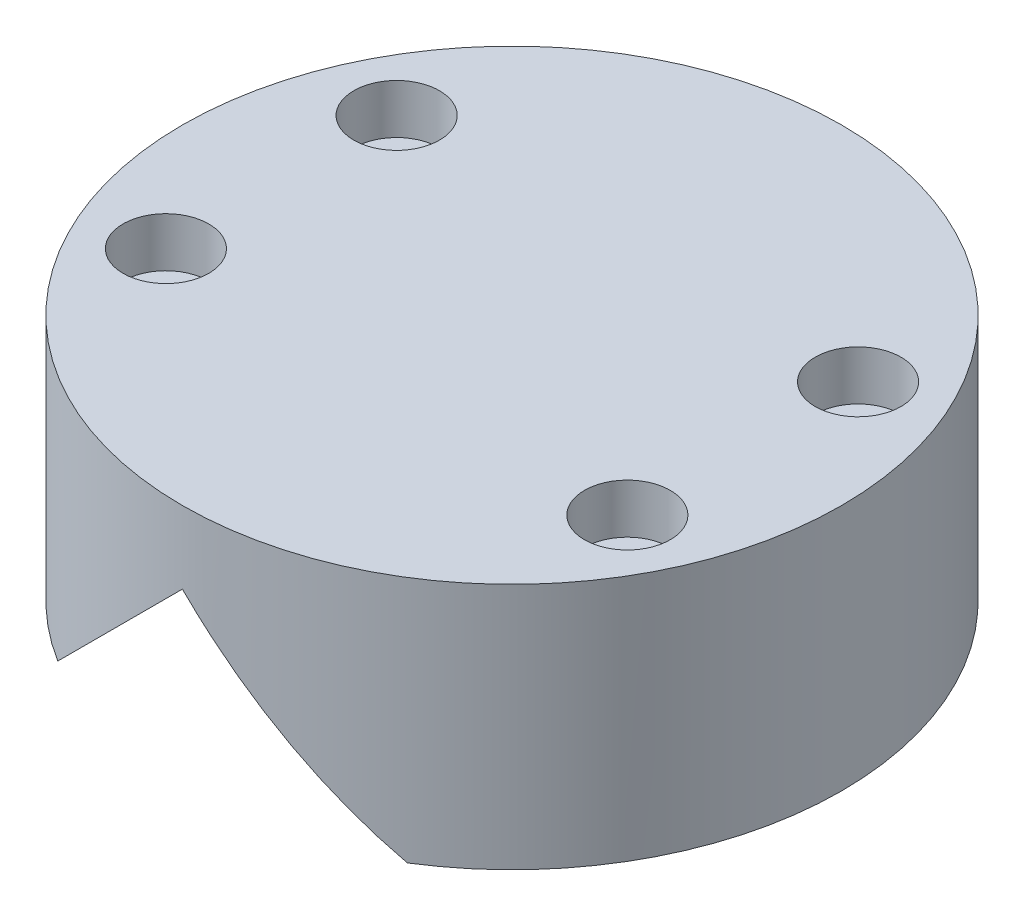
ISO-10303-21;
HEADER;
FILE_DESCRIPTION(('STEP AP214'),'2;1');
FILE_NAME('part.step','',(''),(''),'','','');
FILE_SCHEMA(('AUTOMOTIVE_DESIGN { 1 0 10303 214 1 1 1 1 }'));
ENDSEC;
DATA;
#1=APPLICATION_CONTEXT('core data for automotive mechanical design processes');
#2=APPLICATION_PROTOCOL_DEFINITION('international standard','automotive_design',2000,#1);
#3=PRODUCT_CONTEXT('',#1,'mechanical');
#4=PRODUCT('Part','Part','',(#3));
#5=PRODUCT_RELATED_PRODUCT_CATEGORY('part','',(#4));
#6=PRODUCT_DEFINITION_FORMATION('','',#4);
#7=PRODUCT_DEFINITION_CONTEXT('part definition',#1,'design');
#8=PRODUCT_DEFINITION('design','',#6,#7);
#9=PRODUCT_DEFINITION_SHAPE('','',#8);
#10=(LENGTH_UNIT() NAMED_UNIT(*) SI_UNIT(.MILLI.,.METRE.));
#11=(NAMED_UNIT(*) PLANE_ANGLE_UNIT() SI_UNIT($,.RADIAN.));
#12=(NAMED_UNIT(*) SI_UNIT($,.STERADIAN.) SOLID_ANGLE_UNIT());
#13=UNCERTAINTY_MEASURE_WITH_UNIT(LENGTH_MEASURE(1.E-05),#10,'distance_accuracy_value','');
#14=(GEOMETRIC_REPRESENTATION_CONTEXT(3) GLOBAL_UNCERTAINTY_ASSIGNED_CONTEXT((#13)) GLOBAL_UNIT_ASSIGNED_CONTEXT((#10,
#11,#12)) REPRESENTATION_CONTEXT('',''));
#15=CARTESIAN_POINT('',(0.,0.,0.));
#16=DIRECTION('',(0.,0.,1.));
#17=DIRECTION('',(1.,0.,0.));
#18=AXIS2_PLACEMENT_3D('',#15,#16,#17);
#19=CARTESIAN_POINT('',(-14.,15.001,7.));
#20=DIRECTION('',(0.,-1.,0.));
#21=DIRECTION('',(0.,0.,-1.));
#22=AXIS2_PLACEMENT_3D('',#19,#20,#21);
#23=CYLINDRICAL_SURFACE('',#22,1.5);
#24=CARTESIAN_POINT('',(-14.,0.,7.));
#25=DIRECTION('',(0.,-1.,0.));
#26=DIRECTION('',(0.,0.,-1.));
#27=AXIS2_PLACEMENT_3D('',#24,#25,#26);
#28=CIRCLE('',#27,1.5);
#29=CARTESIAN_POINT('',(-14.,0.,5.5));
#30=VERTEX_POINT('',#29);
#31=EDGE_CURVE('E116',#30,#30,#28,.T.);
#32=CARTESIAN_POINT('',(-14.,12.,7.));
#33=DIRECTION('',(0.,1.,0.));
#34=DIRECTION('',(0.,0.,1.));
#35=AXIS2_PLACEMENT_3D('',#32,#33,#34);
#36=CIRCLE('',#35,1.5);
#37=CARTESIAN_POINT('',(-14.,12.,5.5));
#38=VERTEX_POINT('',#37);
#39=EDGE_CURVE('E37',#38,#38,#36,.F.);
#40=CARTESIAN_POINT('',(-14.,0.,5.5));
#41=CARTESIAN_POINT('',(-14.,0.125,5.5));
#42=CARTESIAN_POINT('',(-14.,0.25,5.5));
#43=CARTESIAN_POINT('',(-14.,0.5,5.5));
#44=CARTESIAN_POINT('',(-14.,0.625000000000001,5.5));
#45=CARTESIAN_POINT('',(-14.,0.875000000000001,5.5));
#46=CARTESIAN_POINT('',(-14.,1.,5.5));
#47=CARTESIAN_POINT('',(-14.,1.25,5.5));
#48=CARTESIAN_POINT('',(-14.,1.375,5.5));
#49=CARTESIAN_POINT('',(-14.,1.625,5.5));
#50=CARTESIAN_POINT('',(-14.,1.75,5.5));
#51=CARTESIAN_POINT('',(-14.,2.,5.5));
#52=CARTESIAN_POINT('',(-14.,2.125,5.5));
#53=CARTESIAN_POINT('',(-14.,2.375,5.5));
#54=CARTESIAN_POINT('',(-14.,2.5,5.5));
#55=CARTESIAN_POINT('',(-14.,2.75,5.5));
#56=CARTESIAN_POINT('',(-14.,2.875,5.5));
#57=CARTESIAN_POINT('',(-14.,3.125,5.5));
#58=CARTESIAN_POINT('',(-14.,3.25,5.5));
#59=CARTESIAN_POINT('',(-14.,3.5,5.5));
#60=CARTESIAN_POINT('',(-14.,3.625,5.5));
#61=CARTESIAN_POINT('',(-14.,3.875,5.5));
#62=CARTESIAN_POINT('',(-14.,4.,5.5));
#63=CARTESIAN_POINT('',(-14.,4.25,5.5));
#64=CARTESIAN_POINT('',(-14.,4.375,5.5));
#65=CARTESIAN_POINT('',(-14.,4.625,5.5));
#66=CARTESIAN_POINT('',(-14.,4.75,5.5));
#67=CARTESIAN_POINT('',(-14.,5.,5.5));
#68=CARTESIAN_POINT('',(-14.,5.125,5.5));
#69=CARTESIAN_POINT('',(-14.,5.375,5.5));
#70=CARTESIAN_POINT('',(-14.,5.5,5.5));
#71=CARTESIAN_POINT('',(-14.,5.75,5.5));
#72=CARTESIAN_POINT('',(-14.,5.875,5.5));
#73=CARTESIAN_POINT('',(-14.,6.125,5.5));
#74=CARTESIAN_POINT('',(-14.,6.25,5.5));
#75=CARTESIAN_POINT('',(-14.,6.5,5.5));
#76=CARTESIAN_POINT('',(-14.,6.625,5.5));
#77=CARTESIAN_POINT('',(-14.,6.875,5.5));
#78=CARTESIAN_POINT('',(-14.,7.,5.5));
#79=CARTESIAN_POINT('',(-14.,7.25,5.5));
#80=CARTESIAN_POINT('',(-14.,7.375,5.5));
#81=CARTESIAN_POINT('',(-14.,7.625,5.5));
#82=CARTESIAN_POINT('',(-14.,7.75,5.5));
#83=CARTESIAN_POINT('',(-14.,8.,5.5));
#84=CARTESIAN_POINT('',(-14.,8.125,5.5));
#85=CARTESIAN_POINT('',(-14.,8.375,5.5));
#86=CARTESIAN_POINT('',(-14.,8.5,5.5));
#87=CARTESIAN_POINT('',(-14.,8.75,5.5));
#88=CARTESIAN_POINT('',(-14.,8.875,5.5));
#89=CARTESIAN_POINT('',(-14.,9.125,5.5));
#90=CARTESIAN_POINT('',(-14.,9.25,5.5));
#91=CARTESIAN_POINT('',(-14.,9.5,5.5));
#92=CARTESIAN_POINT('',(-14.,9.625,5.5));
#93=CARTESIAN_POINT('',(-14.,9.875,5.5));
#94=CARTESIAN_POINT('',(-14.,10.,5.5));
#95=CARTESIAN_POINT('',(-14.,10.25,5.5));
#96=CARTESIAN_POINT('',(-14.,10.375,5.5));
#97=CARTESIAN_POINT('',(-14.,10.625,5.5));
#98=CARTESIAN_POINT('',(-14.,10.75,5.5));
#99=CARTESIAN_POINT('',(-14.,11.,5.5));
#100=CARTESIAN_POINT('',(-14.,11.125,5.5));
#101=CARTESIAN_POINT('',(-14.,11.375,5.5));
#102=CARTESIAN_POINT('',(-14.,11.5,5.5));
#103=CARTESIAN_POINT('',(-14.,11.75,5.5));
#104=CARTESIAN_POINT('',(-14.,11.875,5.5));
#105=CARTESIAN_POINT('',(-14.,12.,5.5));
#106=B_SPLINE_CURVE_WITH_KNOTS('',3,(#40,#41,#42,#43,#44,#45,#46,#47,#48,#49,#50,#51,#52,#53,
#54,#55,#56,#57,#58,#59,#60,#61,#62,#63,#64,#65,#66,#67,#68,#69,#70,#71,#72,#73,#74,#75,#76,#77,
#78,#79,#80,#81,#82,#83,#84,#85,#86,#87,#88,#89,#90,#91,#92,#93,#94,#95,#96,#97,#98,#99,#100,
#101,#102,#103,#104,#105),.UNSPECIFIED.,.F.,.F.,(4,2,2,2,2,2,2,2,2,2,2,2,2,2,2,2,2,2,2,2,2,2,2,
2,2,2,2,2,2,2,2,2,4),(0.,0.375,0.750000000000001,1.125,1.5,1.875,2.25,2.625,3.,3.375,3.75,4.125,
4.5,4.875,5.25,5.625,6.,6.375,6.75,7.125,7.5,7.875,8.25,8.625,9.,9.375,9.75,10.125,10.5,10.875,
11.25,11.625,12.),.UNSPECIFIED.);
#107=EDGE_CURVE('BSEAM33',#30,#38,#106,.T.);
#108=ORIENTED_EDGE('',*,*,#31,.T.);
#109=ORIENTED_EDGE('',*,*,#39,.F.);
#110=ORIENTED_EDGE('',*,*,#107,.T.);
#111=ORIENTED_EDGE('',*,*,#107,.F.);
#112=EDGE_LOOP('',(#108,#110,#109,#111));
#113=FACE_BOUND('',#112,.T.);
#114=ADVANCED_FACE('F33',(#113),#23,.F.);
#115=CARTESIAN_POINT('',(14.,15.001,-7.));
#116=DIRECTION('',(0.,-1.,0.));
#117=DIRECTION('',(0.,0.,-1.));
#118=AXIS2_PLACEMENT_3D('',#115,#116,#117);
#119=CYLINDRICAL_SURFACE('',#118,1.5);
#120=CARTESIAN_POINT('',(14.,0.,-7.));
#121=DIRECTION('',(0.,-1.,0.));
#122=DIRECTION('',(0.,0.,-1.));
#123=AXIS2_PLACEMENT_3D('',#120,#121,#122);
#124=CIRCLE('',#123,1.5);
#125=CARTESIAN_POINT('',(14.,0.,-8.5));
#126=VERTEX_POINT('',#125);
#127=EDGE_CURVE('E100',#126,#126,#124,.T.);
#128=CARTESIAN_POINT('',(14.,12.,-7.));
#129=DIRECTION('',(0.,1.,0.));
#130=DIRECTION('',(0.,0.,1.));
#131=AXIS2_PLACEMENT_3D('',#128,#129,#130);
#132=CIRCLE('',#131,1.5);
#133=CARTESIAN_POINT('',(14.,12.,-8.5));
#134=VERTEX_POINT('',#133);
#135=EDGE_CURVE('E95',#134,#134,#132,.F.);
#136=CARTESIAN_POINT('',(14.,0.,-8.5));
#137=CARTESIAN_POINT('',(14.,0.125,-8.5));
#138=CARTESIAN_POINT('',(14.,0.25,-8.5));
#139=CARTESIAN_POINT('',(14.,0.5,-8.5));
#140=CARTESIAN_POINT('',(14.,0.625000000000001,-8.5));
#141=CARTESIAN_POINT('',(14.,0.875000000000001,-8.5));
#142=CARTESIAN_POINT('',(14.,1.,-8.5));
#143=CARTESIAN_POINT('',(14.,1.25,-8.5));
#144=CARTESIAN_POINT('',(14.,1.375,-8.5));
#145=CARTESIAN_POINT('',(14.,1.625,-8.5));
#146=CARTESIAN_POINT('',(14.,1.75,-8.5));
#147=CARTESIAN_POINT('',(14.,2.,-8.5));
#148=CARTESIAN_POINT('',(14.,2.125,-8.5));
#149=CARTESIAN_POINT('',(14.,2.375,-8.5));
#150=CARTESIAN_POINT('',(14.,2.5,-8.5));
#151=CARTESIAN_POINT('',(14.,2.75,-8.5));
#152=CARTESIAN_POINT('',(14.,2.875,-8.5));
#153=CARTESIAN_POINT('',(14.,3.125,-8.5));
#154=CARTESIAN_POINT('',(14.,3.25,-8.5));
#155=CARTESIAN_POINT('',(14.,3.5,-8.5));
#156=CARTESIAN_POINT('',(14.,3.625,-8.5));
#157=CARTESIAN_POINT('',(14.,3.875,-8.5));
#158=CARTESIAN_POINT('',(14.,4.,-8.5));
#159=CARTESIAN_POINT('',(14.,4.25,-8.5));
#160=CARTESIAN_POINT('',(14.,4.375,-8.5));
#161=CARTESIAN_POINT('',(14.,4.625,-8.5));
#162=CARTESIAN_POINT('',(14.,4.75,-8.5));
#163=CARTESIAN_POINT('',(14.,5.,-8.5));
#164=CARTESIAN_POINT('',(14.,5.125,-8.5));
#165=CARTESIAN_POINT('',(14.,5.375,-8.5));
#166=CARTESIAN_POINT('',(14.,5.5,-8.5));
#167=CARTESIAN_POINT('',(14.,5.75,-8.5));
#168=CARTESIAN_POINT('',(14.,5.875,-8.5));
#169=CARTESIAN_POINT('',(14.,6.125,-8.5));
#170=CARTESIAN_POINT('',(14.,6.25,-8.5));
#171=CARTESIAN_POINT('',(14.,6.5,-8.5));
#172=CARTESIAN_POINT('',(14.,6.625,-8.5));
#173=CARTESIAN_POINT('',(14.,6.875,-8.5));
#174=CARTESIAN_POINT('',(14.,7.,-8.5));
#175=CARTESIAN_POINT('',(14.,7.25,-8.5));
#176=CARTESIAN_POINT('',(14.,7.375,-8.5));
#177=CARTESIAN_POINT('',(14.,7.625,-8.5));
#178=CARTESIAN_POINT('',(14.,7.75,-8.5));
#179=CARTESIAN_POINT('',(14.,8.,-8.5));
#180=CARTESIAN_POINT('',(14.,8.125,-8.5));
#181=CARTESIAN_POINT('',(14.,8.375,-8.5));
#182=CARTESIAN_POINT('',(14.,8.5,-8.5));
#183=CARTESIAN_POINT('',(14.,8.75,-8.5));
#184=CARTESIAN_POINT('',(14.,8.875,-8.5));
#185=CARTESIAN_POINT('',(14.,9.125,-8.5));
#186=CARTESIAN_POINT('',(14.,9.25,-8.5));
#187=CARTESIAN_POINT('',(14.,9.5,-8.5));
#188=CARTESIAN_POINT('',(14.,9.625,-8.5));
#189=CARTESIAN_POINT('',(14.,9.875,-8.5));
#190=CARTESIAN_POINT('',(14.,10.,-8.5));
#191=CARTESIAN_POINT('',(14.,10.25,-8.5));
#192=CARTESIAN_POINT('',(14.,10.375,-8.5));
#193=CARTESIAN_POINT('',(14.,10.625,-8.5));
#194=CARTESIAN_POINT('',(14.,10.75,-8.5));
#195=CARTESIAN_POINT('',(14.,11.,-8.5));
#196=CARTESIAN_POINT('',(14.,11.125,-8.5));
#197=CARTESIAN_POINT('',(14.,11.375,-8.5));
#198=CARTESIAN_POINT('',(14.,11.5,-8.5));
#199=CARTESIAN_POINT('',(14.,11.75,-8.5));
#200=CARTESIAN_POINT('',(14.,11.875,-8.5));
#201=CARTESIAN_POINT('',(14.,12.,-8.5));
#202=B_SPLINE_CURVE_WITH_KNOTS('',3,(#136,#137,#138,#139,#140,#141,#142,#143,#144,#145,#146,
#147,#148,#149,#150,#151,#152,#153,#154,#155,#156,#157,#158,#159,#160,#161,#162,#163,#164,#165,
#166,#167,#168,#169,#170,#171,#172,#173,#174,#175,#176,#177,#178,#179,#180,#181,#182,#183,#184,
#185,#186,#187,#188,#189,#190,#191,#192,#193,#194,#195,#196,#197,#198,#199,#200,#201),
.UNSPECIFIED.,.F.,.F.,(4,2,2,2,2,2,2,2,2,2,2,2,2,2,2,2,2,2,2,2,2,2,2,2,2,2,2,2,2,2,2,2,4),(0.,
0.375,0.750000000000001,1.125,1.5,1.875,2.25,2.625,3.,3.375,3.75,4.125,4.5,4.875,5.25,5.625,6.,
6.375,6.75,7.125,7.5,7.875,8.25,8.625,9.,9.375,9.75,10.125,10.5,10.875,11.25,11.625,12.),.UNSPECIFIED.);
#203=EDGE_CURVE('BSEAM139',#126,#134,#202,.T.);
#204=ORIENTED_EDGE('',*,*,#127,.T.);
#205=ORIENTED_EDGE('',*,*,#135,.F.);
#206=ORIENTED_EDGE('',*,*,#203,.T.);
#207=ORIENTED_EDGE('',*,*,#203,.F.);
#208=EDGE_LOOP('',(#204,#206,#205,#207));
#209=FACE_BOUND('',#208,.T.);
#210=ADVANCED_FACE('F139',(#209),#119,.F.);
#211=CARTESIAN_POINT('',(14.,15.001,7.));
#212=DIRECTION('',(0.,-1.,0.));
#213=DIRECTION('',(0.,0.,-1.));
#214=AXIS2_PLACEMENT_3D('',#211,#212,#213);
#215=CYLINDRICAL_SURFACE('',#214,1.5);
#216=CARTESIAN_POINT('',(14.,0.,7.));
#217=DIRECTION('',(0.,-1.,0.));
#218=DIRECTION('',(0.,0.,-1.));
#219=AXIS2_PLACEMENT_3D('',#216,#217,#218);
#220=CIRCLE('',#219,1.5);
#221=CARTESIAN_POINT('',(14.,0.,5.5));
#222=VERTEX_POINT('',#221);
#223=EDGE_CURVE('E104',#222,#222,#220,.T.);
#224=CARTESIAN_POINT('',(14.,12.,7.));
#225=DIRECTION('',(0.,1.,0.));
#226=DIRECTION('',(0.,0.,1.));
#227=AXIS2_PLACEMENT_3D('',#224,#225,#226);
#228=CIRCLE('',#227,1.5);
#229=CARTESIAN_POINT('',(14.,12.,5.5));
#230=VERTEX_POINT('',#229);
#231=EDGE_CURVE('E92',#230,#230,#228,.F.);
#232=CARTESIAN_POINT('',(14.,0.,5.5));
#233=CARTESIAN_POINT('',(14.,0.125,5.5));
#234=CARTESIAN_POINT('',(14.,0.25,5.5));
#235=CARTESIAN_POINT('',(14.,0.5,5.5));
#236=CARTESIAN_POINT('',(14.,0.625000000000001,5.5));
#237=CARTESIAN_POINT('',(14.,0.875000000000001,5.5));
#238=CARTESIAN_POINT('',(14.,1.,5.5));
#239=CARTESIAN_POINT('',(14.,1.25,5.5));
#240=CARTESIAN_POINT('',(14.,1.375,5.5));
#241=CARTESIAN_POINT('',(14.,1.625,5.5));
#242=CARTESIAN_POINT('',(14.,1.75,5.5));
#243=CARTESIAN_POINT('',(14.,2.,5.5));
#244=CARTESIAN_POINT('',(14.,2.125,5.5));
#245=CARTESIAN_POINT('',(14.,2.375,5.5));
#246=CARTESIAN_POINT('',(14.,2.5,5.5));
#247=CARTESIAN_POINT('',(14.,2.75,5.5));
#248=CARTESIAN_POINT('',(14.,2.875,5.5));
#249=CARTESIAN_POINT('',(14.,3.125,5.5));
#250=CARTESIAN_POINT('',(14.,3.25,5.5));
#251=CARTESIAN_POINT('',(14.,3.5,5.5));
#252=CARTESIAN_POINT('',(14.,3.625,5.5));
#253=CARTESIAN_POINT('',(14.,3.875,5.5));
#254=CARTESIAN_POINT('',(14.,4.,5.5));
#255=CARTESIAN_POINT('',(14.,4.25,5.5));
#256=CARTESIAN_POINT('',(14.,4.375,5.5));
#257=CARTESIAN_POINT('',(14.,4.625,5.5));
#258=CARTESIAN_POINT('',(14.,4.75,5.5));
#259=CARTESIAN_POINT('',(14.,5.,5.5));
#260=CARTESIAN_POINT('',(14.,5.125,5.5));
#261=CARTESIAN_POINT('',(14.,5.375,5.5));
#262=CARTESIAN_POINT('',(14.,5.5,5.5));
#263=CARTESIAN_POINT('',(14.,5.75,5.5));
#264=CARTESIAN_POINT('',(14.,5.875,5.5));
#265=CARTESIAN_POINT('',(14.,6.125,5.5));
#266=CARTESIAN_POINT('',(14.,6.25,5.5));
#267=CARTESIAN_POINT('',(14.,6.5,5.5));
#268=CARTESIAN_POINT('',(14.,6.625,5.5));
#269=CARTESIAN_POINT('',(14.,6.875,5.5));
#270=CARTESIAN_POINT('',(14.,7.,5.5));
#271=CARTESIAN_POINT('',(14.,7.25,5.5));
#272=CARTESIAN_POINT('',(14.,7.375,5.5));
#273=CARTESIAN_POINT('',(14.,7.625,5.5));
#274=CARTESIAN_POINT('',(14.,7.75,5.5));
#275=CARTESIAN_POINT('',(14.,8.,5.5));
#276=CARTESIAN_POINT('',(14.,8.125,5.5));
#277=CARTESIAN_POINT('',(14.,8.375,5.5));
#278=CARTESIAN_POINT('',(14.,8.5,5.5));
#279=CARTESIAN_POINT('',(14.,8.75,5.5));
#280=CARTESIAN_POINT('',(14.,8.875,5.5));
#281=CARTESIAN_POINT('',(14.,9.125,5.5));
#282=CARTESIAN_POINT('',(14.,9.25,5.5));
#283=CARTESIAN_POINT('',(14.,9.5,5.5));
#284=CARTESIAN_POINT('',(14.,9.625,5.5));
#285=CARTESIAN_POINT('',(14.,9.875,5.5));
#286=CARTESIAN_POINT('',(14.,10.,5.5));
#287=CARTESIAN_POINT('',(14.,10.25,5.5));
#288=CARTESIAN_POINT('',(14.,10.375,5.5));
#289=CARTESIAN_POINT('',(14.,10.625,5.5));
#290=CARTESIAN_POINT('',(14.,10.75,5.5));
#291=CARTESIAN_POINT('',(14.,11.,5.5));
#292=CARTESIAN_POINT('',(14.,11.125,5.5));
#293=CARTESIAN_POINT('',(14.,11.375,5.5));
#294=CARTESIAN_POINT('',(14.,11.5,5.5));
#295=CARTESIAN_POINT('',(14.,11.75,5.5));
#296=CARTESIAN_POINT('',(14.,11.875,5.5));
#297=CARTESIAN_POINT('',(14.,12.,5.5));
#298=B_SPLINE_CURVE_WITH_KNOTS('',3,(#232,#233,#234,#235,#236,#237,#238,#239,#240,#241,#242,
#243,#244,#245,#246,#247,#248,#249,#250,#251,#252,#253,#254,#255,#256,#257,#258,#259,#260,#261,
#262,#263,#264,#265,#266,#267,#268,#269,#270,#271,#272,#273,#274,#275,#276,#277,#278,#279,#280,
#281,#282,#283,#284,#285,#286,#287,#288,#289,#290,#291,#292,#293,#294,#295,#296,#297),
.UNSPECIFIED.,.F.,.F.,(4,2,2,2,2,2,2,2,2,2,2,2,2,2,2,2,2,2,2,2,2,2,2,2,2,2,2,2,2,2,2,2,4),(0.,
0.375,0.750000000000001,1.125,1.5,1.875,2.25,2.625,3.,3.375,3.75,4.125,4.5,4.875,5.25,5.625,6.,
6.375,6.75,7.125,7.5,7.875,8.25,8.625,9.,9.375,9.75,10.125,10.5,10.875,11.25,11.625,12.),.UNSPECIFIED.);
#299=EDGE_CURVE('BSEAM145',#222,#230,#298,.T.);
#300=ORIENTED_EDGE('',*,*,#223,.T.);
#301=ORIENTED_EDGE('',*,*,#231,.F.);
#302=ORIENTED_EDGE('',*,*,#299,.T.);
#303=ORIENTED_EDGE('',*,*,#299,.F.);
#304=EDGE_LOOP('',(#300,#302,#301,#303));
#305=FACE_BOUND('',#304,.T.);
#306=ADVANCED_FACE('F145',(#305),#215,.F.);
#307=CARTESIAN_POINT('',(-14.,15.001,-7.));
#308=DIRECTION('',(0.,-1.,0.));
#309=DIRECTION('',(0.,0.,-1.));
#310=AXIS2_PLACEMENT_3D('',#307,#308,#309);
#311=CYLINDRICAL_SURFACE('',#310,1.5);
#312=CARTESIAN_POINT('',(-14.,0.,-7.));
#313=DIRECTION('',(0.,-1.,0.));
#314=DIRECTION('',(0.,0.,-1.));
#315=AXIS2_PLACEMENT_3D('',#312,#313,#314);
#316=CIRCLE('',#315,1.5);
#317=CARTESIAN_POINT('',(-14.,0.,-8.5));
#318=VERTEX_POINT('',#317);
#319=EDGE_CURVE('E109',#318,#318,#316,.T.);
#320=CARTESIAN_POINT('',(-14.,12.,-7.));
#321=DIRECTION('',(0.,1.,0.));
#322=DIRECTION('',(0.,0.,1.));
#323=AXIS2_PLACEMENT_3D('',#320,#321,#322);
#324=CIRCLE('',#323,1.5);
#325=CARTESIAN_POINT('',(-14.,12.,-8.5));
#326=VERTEX_POINT('',#325);
#327=EDGE_CURVE('E89',#326,#326,#324,.F.);
#328=CARTESIAN_POINT('',(-14.,0.,-8.5));
#329=CARTESIAN_POINT('',(-14.,0.125,-8.5));
#330=CARTESIAN_POINT('',(-14.,0.25,-8.5));
#331=CARTESIAN_POINT('',(-14.,0.5,-8.5));
#332=CARTESIAN_POINT('',(-14.,0.625000000000001,-8.5));
#333=CARTESIAN_POINT('',(-14.,0.875000000000001,-8.5));
#334=CARTESIAN_POINT('',(-14.,1.,-8.5));
#335=CARTESIAN_POINT('',(-14.,1.25,-8.5));
#336=CARTESIAN_POINT('',(-14.,1.375,-8.5));
#337=CARTESIAN_POINT('',(-14.,1.625,-8.5));
#338=CARTESIAN_POINT('',(-14.,1.75,-8.5));
#339=CARTESIAN_POINT('',(-14.,2.,-8.5));
#340=CARTESIAN_POINT('',(-14.,2.125,-8.5));
#341=CARTESIAN_POINT('',(-14.,2.375,-8.5));
#342=CARTESIAN_POINT('',(-14.,2.5,-8.5));
#343=CARTESIAN_POINT('',(-14.,2.75,-8.5));
#344=CARTESIAN_POINT('',(-14.,2.875,-8.5));
#345=CARTESIAN_POINT('',(-14.,3.125,-8.5));
#346=CARTESIAN_POINT('',(-14.,3.25,-8.5));
#347=CARTESIAN_POINT('',(-14.,3.5,-8.5));
#348=CARTESIAN_POINT('',(-14.,3.625,-8.5));
#349=CARTESIAN_POINT('',(-14.,3.875,-8.5));
#350=CARTESIAN_POINT('',(-14.,4.,-8.5));
#351=CARTESIAN_POINT('',(-14.,4.25,-8.5));
#352=CARTESIAN_POINT('',(-14.,4.375,-8.5));
#353=CARTESIAN_POINT('',(-14.,4.625,-8.5));
#354=CARTESIAN_POINT('',(-14.,4.75,-8.5));
#355=CARTESIAN_POINT('',(-14.,5.,-8.5));
#356=CARTESIAN_POINT('',(-14.,5.125,-8.5));
#357=CARTESIAN_POINT('',(-14.,5.375,-8.5));
#358=CARTESIAN_POINT('',(-14.,5.5,-8.5));
#359=CARTESIAN_POINT('',(-14.,5.75,-8.5));
#360=CARTESIAN_POINT('',(-14.,5.875,-8.5));
#361=CARTESIAN_POINT('',(-14.,6.125,-8.5));
#362=CARTESIAN_POINT('',(-14.,6.25,-8.5));
#363=CARTESIAN_POINT('',(-14.,6.5,-8.5));
#364=CARTESIAN_POINT('',(-14.,6.625,-8.5));
#365=CARTESIAN_POINT('',(-14.,6.875,-8.5));
#366=CARTESIAN_POINT('',(-14.,7.,-8.5));
#367=CARTESIAN_POINT('',(-14.,7.25,-8.5));
#368=CARTESIAN_POINT('',(-14.,7.375,-8.5));
#369=CARTESIAN_POINT('',(-14.,7.625,-8.5));
#370=CARTESIAN_POINT('',(-14.,7.75,-8.5));
#371=CARTESIAN_POINT('',(-14.,8.,-8.5));
#372=CARTESIAN_POINT('',(-14.,8.125,-8.5));
#373=CARTESIAN_POINT('',(-14.,8.375,-8.5));
#374=CARTESIAN_POINT('',(-14.,8.5,-8.5));
#375=CARTESIAN_POINT('',(-14.,8.75,-8.5));
#376=CARTESIAN_POINT('',(-14.,8.875,-8.5));
#377=CARTESIAN_POINT('',(-14.,9.125,-8.5));
#378=CARTESIAN_POINT('',(-14.,9.25,-8.5));
#379=CARTESIAN_POINT('',(-14.,9.5,-8.5));
#380=CARTESIAN_POINT('',(-14.,9.625,-8.5));
#381=CARTESIAN_POINT('',(-14.,9.875,-8.5));
#382=CARTESIAN_POINT('',(-14.,10.,-8.5));
#383=CARTESIAN_POINT('',(-14.,10.25,-8.5));
#384=CARTESIAN_POINT('',(-14.,10.375,-8.5));
#385=CARTESIAN_POINT('',(-14.,10.625,-8.5));
#386=CARTESIAN_POINT('',(-14.,10.75,-8.5));
#387=CARTESIAN_POINT('',(-14.,11.,-8.5));
#388=CARTESIAN_POINT('',(-14.,11.125,-8.5));
#389=CARTESIAN_POINT('',(-14.,11.375,-8.5));
#390=CARTESIAN_POINT('',(-14.,11.5,-8.5));
#391=CARTESIAN_POINT('',(-14.,11.75,-8.5));
#392=CARTESIAN_POINT('',(-14.,11.875,-8.5));
#393=CARTESIAN_POINT('',(-14.,12.,-8.5));
#394=B_SPLINE_CURVE_WITH_KNOTS('',3,(#328,#329,#330,#331,#332,#333,#334,#335,#336,#337,#338,
#339,#340,#341,#342,#343,#344,#345,#346,#347,#348,#349,#350,#351,#352,#353,#354,#355,#356,#357,
#358,#359,#360,#361,#362,#363,#364,#365,#366,#367,#368,#369,#370,#371,#372,#373,#374,#375,#376,
#377,#378,#379,#380,#381,#382,#383,#384,#385,#386,#387,#388,#389,#390,#391,#392,#393),
.UNSPECIFIED.,.F.,.F.,(4,2,2,2,2,2,2,2,2,2,2,2,2,2,2,2,2,2,2,2,2,2,2,2,2,2,2,2,2,2,2,2,4),(0.,
0.375,0.750000000000001,1.125,1.5,1.875,2.25,2.625,3.,3.375,3.75,4.125,4.5,4.875,5.25,5.625,6.,
6.375,6.75,7.125,7.5,7.875,8.25,8.625,9.,9.375,9.75,10.125,10.5,10.875,11.25,11.625,12.),.UNSPECIFIED.);
#395=EDGE_CURVE('BSEAM133',#318,#326,#394,.T.);
#396=ORIENTED_EDGE('',*,*,#319,.T.);
#397=ORIENTED_EDGE('',*,*,#327,.F.);
#398=ORIENTED_EDGE('',*,*,#395,.T.);
#399=ORIENTED_EDGE('',*,*,#395,.F.);
#400=EDGE_LOOP('',(#396,#398,#397,#399));
#401=FACE_BOUND('',#400,.T.);
#402=ADVANCED_FACE('F133',(#401),#311,.F.);
#403=CARTESIAN_POINT('',(0.,15.,0.));
#404=DIRECTION('',(0.,-1.,0.));
#405=DIRECTION('',(0.,0.,-1.));
#406=AXIS2_PLACEMENT_3D('',#403,#404,#405);
#407=CYLINDRICAL_SURFACE('',#406,20.);
#408=CARTESIAN_POINT('',(0.,15.,0.));
#409=DIRECTION('',(0.,1.,0.));
#410=DIRECTION('',(0.,0.,1.));
#411=AXIS2_PLACEMENT_3D('',#408,#409,#410);
#412=CIRCLE('',#411,20.);
#413=CARTESIAN_POINT('',(0.,15.,20.));
#414=VERTEX_POINT('',#413);
#415=EDGE_CURVE('E73',#414,#414,#412,.T.);
#416=ORIENTED_EDGE('',*,*,#415,.F.);
#417=EDGE_LOOP('',(#416));
#418=FACE_BOUND('',#417,.T.);
#419=CARTESIAN_POINT('',(0.,10.6066017177982,0.));
#420=DIRECTION('',(0.707106781186544,-0.707106781186551,0.));
#421=DIRECTION('',(-0.707106781186551,-0.707106781186544,0.));
#422=AXIS2_PLACEMENT_3D('',#419,#420,#421);
#423=ELLIPSE('',#422,28.2842712474617,20.);
#424=CARTESIAN_POINT('',(0.,10.6066017177982,20.));
#425=VERTEX_POINT('',#424);
#426=CARTESIAN_POINT('',(-10.6066017177983,0.,16.9558249578131));
#427=VERTEX_POINT('',#426);
#428=EDGE_CURVE('E79',#425,#427,#423,.T.);
#429=ORIENTED_EDGE('',*,*,#428,.F.);
#430=CARTESIAN_POINT('',(0.,10.6066017177982,0.));
#431=DIRECTION('',(-0.707106781186544,-0.707106781186551,0.));
#432=DIRECTION('',(0.707106781186551,-0.707106781186544,0.));
#433=AXIS2_PLACEMENT_3D('',#430,#431,#432);
#434=ELLIPSE('',#433,28.2842712474617,20.);
#435=CARTESIAN_POINT('',(10.6066017177983,0.,16.9558249578131));
#436=VERTEX_POINT('',#435);
#437=EDGE_CURVE('E68',#436,#425,#434,.T.);
#438=ORIENTED_EDGE('',*,*,#437,.F.);
#439=CARTESIAN_POINT('',(0.,0.,0.));
#440=DIRECTION('',(0.,1.,0.));
#441=DIRECTION('',(0.,0.,1.));
#442=AXIS2_PLACEMENT_3D('',#439,#440,#441);
#443=CIRCLE('',#442,20.);
#444=CARTESIAN_POINT('',(10.6066017177983,0.,-16.9558249578131));
#445=VERTEX_POINT('',#444);
#446=EDGE_CURVE('E77',#436,#445,#443,.T.);
#447=ORIENTED_EDGE('',*,*,#446,.T.);
#448=CARTESIAN_POINT('',(0.,10.6066017177982,-20.));
#449=VERTEX_POINT('',#448);
#450=EDGE_CURVE('E50',#449,#445,#434,.T.);
#451=ORIENTED_EDGE('',*,*,#450,.F.);
#452=CARTESIAN_POINT('',(-10.6066017177983,0.,-16.9558249578131));
#453=VERTEX_POINT('',#452);
#454=EDGE_CURVE('E86',#453,#449,#423,.T.);
#455=ORIENTED_EDGE('',*,*,#454,.F.);
#456=EDGE_CURVE('E82',#453,#427,#443,.T.);
#457=ORIENTED_EDGE('',*,*,#456,.T.);
#458=EDGE_LOOP('',(#429,#438,#447,#451,#455,#457));
#459=FACE_BOUND('',#458,.T.);
#460=ADVANCED_FACE('F35',(#418,#459),#407,.T.);
#461=CARTESIAN_POINT('',(0.,0.,0.));
#462=DIRECTION('',(0.,1.,0.));
#463=DIRECTION('',(0.,0.,1.));
#464=AXIS2_PLACEMENT_3D('',#461,#462,#463);
#465=PLANE('',#464);
#466=ORIENTED_EDGE('',*,*,#319,.F.);
#467=EDGE_LOOP('',(#466));
#468=FACE_BOUND('',#467,.T.);
#469=ORIENTED_EDGE('',*,*,#31,.F.);
#470=EDGE_LOOP('',(#469));
#471=FACE_BOUND('',#470,.T.);
#472=DIRECTION('',(0.,0.,-1.));
#473=VECTOR('',#472,1.);
#474=CARTESIAN_POINT('',(-10.6066017177983,0.,0.));
#475=LINE('',#474,#473);
#476=EDGE_CURVE('E11',#427,#453,#475,.T.);
#477=ORIENTED_EDGE('',*,*,#476,.F.);
#478=ORIENTED_EDGE('',*,*,#456,.F.);
#479=EDGE_LOOP('',(#477,#478));
#480=FACE_BOUND('',#479,.T.);
#481=ADVANCED_FACE('F124',(#468,#471,#480),#465,.F.);
#482=ORIENTED_EDGE('',*,*,#223,.F.);
#483=EDGE_LOOP('',(#482));
#484=FACE_BOUND('',#483,.T.);
#485=ORIENTED_EDGE('',*,*,#127,.F.);
#486=EDGE_LOOP('',(#485));
#487=FACE_BOUND('',#486,.T.);
#488=DIRECTION('',(0.,0.,1.));
#489=VECTOR('',#488,1.);
#490=CARTESIAN_POINT('',(10.6066017177983,0.,0.));
#491=LINE('',#490,#489);
#492=EDGE_CURVE('E42',#445,#436,#491,.T.);
#493=ORIENTED_EDGE('',*,*,#492,.F.);
#494=ORIENTED_EDGE('',*,*,#446,.F.);
#495=EDGE_LOOP('',(#493,#494));
#496=FACE_BOUND('',#495,.T.);
#497=ADVANCED_FACE('F81',(#484,#487,#496),#465,.F.);
#498=CARTESIAN_POINT('',(0.,15.,0.));
#499=DIRECTION('',(0.,1.,0.));
#500=DIRECTION('',(0.,0.,1.));
#501=AXIS2_PLACEMENT_3D('',#498,#499,#500);
#502=PLANE('',#501);
#503=CARTESIAN_POINT('',(-14.,15.,7.));
#504=DIRECTION('',(0.,1.,0.));
#505=DIRECTION('',(0.,0.,1.));
#506=AXIS2_PLACEMENT_3D('',#503,#504,#505);
#507=CIRCLE('',#506,2.6);
#508=CARTESIAN_POINT('',(-14.,15.,9.6));
#509=VERTEX_POINT('',#508);
#510=EDGE_CURVE('E162',#509,#509,#507,.T.);
#511=ORIENTED_EDGE('',*,*,#510,.F.);
#512=EDGE_LOOP('',(#511));
#513=FACE_BOUND('',#512,.T.);
#514=CARTESIAN_POINT('',(14.,15.,-7.));
#515=DIRECTION('',(0.,1.,0.));
#516=DIRECTION('',(0.,0.,1.));
#517=AXIS2_PLACEMENT_3D('',#514,#515,#516);
#518=CIRCLE('',#517,2.6);
#519=CARTESIAN_POINT('',(14.,15.,-4.4));
#520=VERTEX_POINT('',#519);
#521=EDGE_CURVE('E166',#520,#520,#518,.T.);
#522=ORIENTED_EDGE('',*,*,#521,.F.);
#523=EDGE_LOOP('',(#522));
#524=FACE_BOUND('',#523,.T.);
#525=CARTESIAN_POINT('',(14.,15.,7.));
#526=DIRECTION('',(0.,1.,0.));
#527=DIRECTION('',(0.,0.,1.));
#528=AXIS2_PLACEMENT_3D('',#525,#526,#527);
#529=CIRCLE('',#528,2.6);
#530=CARTESIAN_POINT('',(14.,15.,9.6));
#531=VERTEX_POINT('',#530);
#532=EDGE_CURVE('E170',#531,#531,#529,.T.);
#533=ORIENTED_EDGE('',*,*,#532,.F.);
#534=EDGE_LOOP('',(#533));
#535=FACE_BOUND('',#534,.T.);
#536=CARTESIAN_POINT('',(-14.,15.,-7.));
#537=DIRECTION('',(0.,1.,0.));
#538=DIRECTION('',(0.,0.,1.));
#539=AXIS2_PLACEMENT_3D('',#536,#537,#538);
#540=CIRCLE('',#539,2.6);
#541=CARTESIAN_POINT('',(-14.,15.,-4.4));
#542=VERTEX_POINT('',#541);
#543=EDGE_CURVE('E113',#542,#542,#540,.T.);
#544=ORIENTED_EDGE('',*,*,#543,.F.);
#545=EDGE_LOOP('',(#544));
#546=FACE_BOUND('',#545,.T.);
#547=ORIENTED_EDGE('',*,*,#415,.T.);
#548=EDGE_LOOP('',(#547));
#549=FACE_BOUND('',#548,.T.);
#550=ADVANCED_FACE('F131',(#513,#524,#535,#546,#549),#502,.T.);
#551=CARTESIAN_POINT('',(0.,10.6066017177982,25.));
#552=DIRECTION('',(0.707106781186544,-0.707106781186551,0.));
#553=DIRECTION('',(0.707106781186551,0.707106781186544,0.));
#554=AXIS2_PLACEMENT_3D('',#551,#552,#553);
#555=PLANE('',#554);
#556=ORIENTED_EDGE('',*,*,#454,.T.);
#557=DIRECTION('',(0.,0.,-1.));
#558=VECTOR('',#557,1.);
#559=CARTESIAN_POINT('',(0.,10.6066017177982,25.));
#560=LINE('',#559,#558);
#561=EDGE_CURVE('E120',#425,#449,#560,.T.);
#562=ORIENTED_EDGE('',*,*,#561,.F.);
#563=ORIENTED_EDGE('',*,*,#428,.T.);
#564=ORIENTED_EDGE('',*,*,#476,.T.);
#565=EDGE_LOOP('',(#556,#562,#563,#564));
#566=FACE_BOUND('',#565,.T.);
#567=ADVANCED_FACE('F121',(#566),#555,.T.);
#568=CARTESIAN_POINT('',(10.6066017177983,0.,25.));
#569=DIRECTION('',(-0.707106781186544,-0.707106781186551,0.));
#570=DIRECTION('',(0.707106781186551,-0.707106781186544,0.));
#571=AXIS2_PLACEMENT_3D('',#568,#569,#570);
#572=PLANE('',#571);
#573=ORIENTED_EDGE('',*,*,#437,.T.);
#574=ORIENTED_EDGE('',*,*,#561,.T.);
#575=ORIENTED_EDGE('',*,*,#450,.T.);
#576=ORIENTED_EDGE('',*,*,#492,.T.);
#577=EDGE_LOOP('',(#573,#574,#575,#576));
#578=FACE_BOUND('',#577,.T.);
#579=ADVANCED_FACE('F67',(#578),#572,.T.);
#580=CARTESIAN_POINT('',(-14.,12.,-7.));
#581=DIRECTION('',(0.,1.,0.));
#582=DIRECTION('',(0.,0.,1.));
#583=AXIS2_PLACEMENT_3D('',#580,#581,#582);
#584=PLANE('',#583);
#585=CARTESIAN_POINT('',(-14.,12.,-7.));
#586=DIRECTION('',(0.,1.,0.));
#587=DIRECTION('',(0.,0.,1.));
#588=AXIS2_PLACEMENT_3D('',#585,#586,#587);
#589=CIRCLE('',#588,2.6);
#590=CARTESIAN_POINT('',(-14.,12.,-4.4));
#591=VERTEX_POINT('',#590);
#592=EDGE_CURVE('E93',#591,#591,#589,.T.);
#593=ORIENTED_EDGE('',*,*,#592,.T.);
#594=EDGE_LOOP('',(#593));
#595=FACE_BOUND('',#594,.T.);
#596=ORIENTED_EDGE('',*,*,#327,.T.);
#597=EDGE_LOOP('',(#596));
#598=FACE_BOUND('',#597,.T.);
#599=ADVANCED_FACE('F153',(#595,#598),#584,.T.);
#600=CARTESIAN_POINT('',(-14.,12.,-7.));
#601=DIRECTION('',(0.,1.,0.));
#602=DIRECTION('',(0.,0.,1.));
#603=AXIS2_PLACEMENT_3D('',#600,#601,#602);
#604=CYLINDRICAL_SURFACE('',#603,2.6);
#605=ORIENTED_EDGE('',*,*,#592,.F.);
#606=EDGE_LOOP('',(#605));
#607=FACE_BOUND('',#606,.T.);
#608=ORIENTED_EDGE('',*,*,#543,.T.);
#609=EDGE_LOOP('',(#608));
#610=FACE_BOUND('',#609,.T.);
#611=ADVANCED_FACE('F208',(#607,#610),#604,.F.);
#612=CARTESIAN_POINT('',(14.,12.,7.));
#613=DIRECTION('',(0.,1.,0.));
#614=DIRECTION('',(0.,0.,1.));
#615=AXIS2_PLACEMENT_3D('',#612,#613,#614);
#616=PLANE('',#615);
#617=CARTESIAN_POINT('',(14.,12.,7.));
#618=DIRECTION('',(0.,1.,0.));
#619=DIRECTION('',(0.,0.,1.));
#620=AXIS2_PLACEMENT_3D('',#617,#618,#619);
#621=CIRCLE('',#620,2.6);
#622=CARTESIAN_POINT('',(14.,12.,9.6));
#623=VERTEX_POINT('',#622);
#624=EDGE_CURVE('E189',#623,#623,#621,.T.);
#625=ORIENTED_EDGE('',*,*,#624,.T.);
#626=EDGE_LOOP('',(#625));
#627=FACE_BOUND('',#626,.T.);
#628=ORIENTED_EDGE('',*,*,#231,.T.);
#629=EDGE_LOOP('',(#628));
#630=FACE_BOUND('',#629,.T.);
#631=ADVANCED_FACE('F198',(#627,#630),#616,.T.);
#632=CARTESIAN_POINT('',(14.,12.,7.));
#633=DIRECTION('',(0.,1.,0.));
#634=DIRECTION('',(0.,0.,1.));
#635=AXIS2_PLACEMENT_3D('',#632,#633,#634);
#636=CYLINDRICAL_SURFACE('',#635,2.6);
#637=ORIENTED_EDGE('',*,*,#624,.F.);
#638=EDGE_LOOP('',(#637));
#639=FACE_BOUND('',#638,.T.);
#640=ORIENTED_EDGE('',*,*,#532,.T.);
#641=EDGE_LOOP('',(#640));
#642=FACE_BOUND('',#641,.T.);
#643=ADVANCED_FACE('F195',(#639,#642),#636,.F.);
#644=CARTESIAN_POINT('',(14.,12.,-7.));
#645=DIRECTION('',(0.,1.,0.));
#646=DIRECTION('',(0.,0.,1.));
#647=AXIS2_PLACEMENT_3D('',#644,#645,#646);
#648=PLANE('',#647);
#649=CARTESIAN_POINT('',(14.,12.,-7.));
#650=DIRECTION('',(0.,1.,0.));
#651=DIRECTION('',(0.,0.,1.));
#652=AXIS2_PLACEMENT_3D('',#649,#650,#651);
#653=CIRCLE('',#652,2.6);
#654=CARTESIAN_POINT('',(14.,12.,-4.4));
#655=VERTEX_POINT('',#654);
#656=EDGE_CURVE('E182',#655,#655,#653,.T.);
#657=ORIENTED_EDGE('',*,*,#656,.T.);
#658=EDGE_LOOP('',(#657));
#659=FACE_BOUND('',#658,.T.);
#660=ORIENTED_EDGE('',*,*,#135,.T.);
#661=EDGE_LOOP('',(#660));
#662=FACE_BOUND('',#661,.T.);
#663=ADVANCED_FACE('F197',(#659,#662),#648,.T.);
#664=CARTESIAN_POINT('',(14.,12.,-7.));
#665=DIRECTION('',(0.,1.,0.));
#666=DIRECTION('',(0.,0.,1.));
#667=AXIS2_PLACEMENT_3D('',#664,#665,#666);
#668=CYLINDRICAL_SURFACE('',#667,2.6);
#669=ORIENTED_EDGE('',*,*,#656,.F.);
#670=EDGE_LOOP('',(#669));
#671=FACE_BOUND('',#670,.T.);
#672=ORIENTED_EDGE('',*,*,#521,.T.);
#673=EDGE_LOOP('',(#672));
#674=FACE_BOUND('',#673,.T.);
#675=ADVANCED_FACE('F205',(#671,#674),#668,.F.);
#676=CARTESIAN_POINT('',(-14.,12.,7.));
#677=DIRECTION('',(0.,1.,0.));
#678=DIRECTION('',(0.,0.,1.));
#679=AXIS2_PLACEMENT_3D('',#676,#677,#678);
#680=PLANE('',#679);
#681=CARTESIAN_POINT('',(-14.,12.,7.));
#682=DIRECTION('',(0.,1.,0.));
#683=DIRECTION('',(0.,0.,1.));
#684=AXIS2_PLACEMENT_3D('',#681,#682,#683);
#685=CIRCLE('',#684,2.6);
#686=CARTESIAN_POINT('',(-14.,12.,9.6));
#687=VERTEX_POINT('',#686);
#688=EDGE_CURVE('E176',#687,#687,#685,.T.);
#689=ORIENTED_EDGE('',*,*,#688,.T.);
#690=EDGE_LOOP('',(#689));
#691=FACE_BOUND('',#690,.T.);
#692=ORIENTED_EDGE('',*,*,#39,.T.);
#693=EDGE_LOOP('',(#692));
#694=FACE_BOUND('',#693,.T.);
#695=ADVANCED_FACE('F211',(#691,#694),#680,.T.);
#696=CARTESIAN_POINT('',(-14.,12.,7.));
#697=DIRECTION('',(0.,1.,0.));
#698=DIRECTION('',(0.,0.,1.));
#699=AXIS2_PLACEMENT_3D('',#696,#697,#698);
#700=CYLINDRICAL_SURFACE('',#699,2.6);
#701=ORIENTED_EDGE('',*,*,#688,.F.);
#702=EDGE_LOOP('',(#701));
#703=FACE_BOUND('',#702,.T.);
#704=ORIENTED_EDGE('',*,*,#510,.T.);
#705=EDGE_LOOP('',(#704));
#706=FACE_BOUND('',#705,.T.);
#707=ADVANCED_FACE('F214',(#703,#706),#700,.F.);
#708=CLOSED_SHELL('',(#114,#210,#306,#402,#460,#481,#497,#550,#567,#579,#599,#611,#631,#643,
#663,#675,#695,#707));
#709=MANIFOLD_SOLID_BREP('B2',#708);
#710=ADVANCED_BREP_SHAPE_REPRESENTATION('',(#18,#709),#14);
#711=SHAPE_DEFINITION_REPRESENTATION(#9,#710);
ENDSEC;
END-ISO-10303-21;
